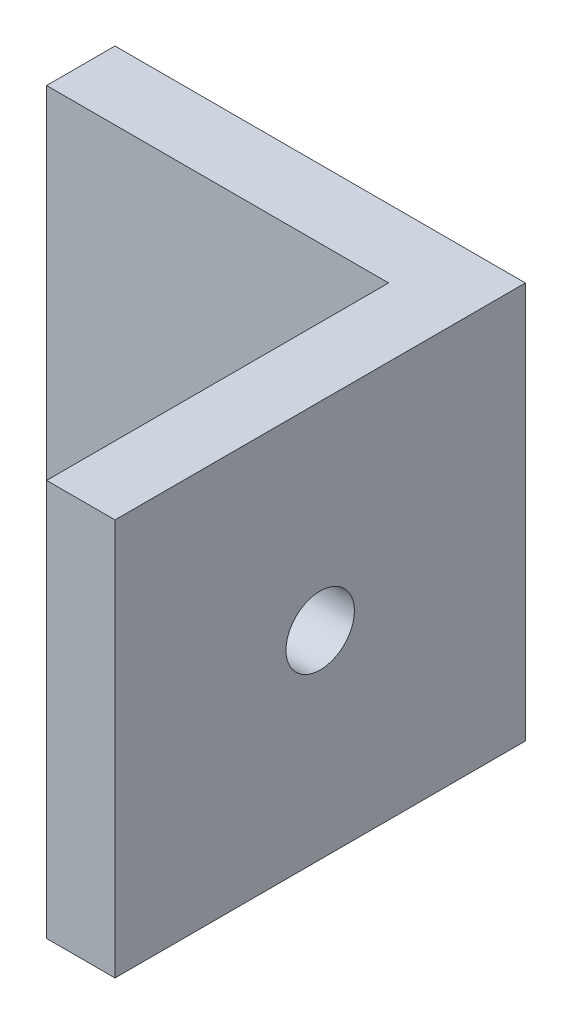
ISO-10303-21;
HEADER;
FILE_DESCRIPTION(('STEP AP214'),'2;1');
FILE_NAME('part.step','',(''),(''),'','','');
FILE_SCHEMA(('AUTOMOTIVE_DESIGN { 1 0 10303 214 1 1 1 1 }'));
ENDSEC;
DATA;
#1=APPLICATION_CONTEXT('core data for automotive mechanical design processes');
#2=APPLICATION_PROTOCOL_DEFINITION('international standard','automotive_design',2000,#1);
#3=PRODUCT_CONTEXT('',#1,'mechanical');
#4=PRODUCT('Part','Part','',(#3));
#5=PRODUCT_RELATED_PRODUCT_CATEGORY('part','',(#4));
#6=PRODUCT_DEFINITION_FORMATION('','',#4);
#7=PRODUCT_DEFINITION_CONTEXT('part definition',#1,'design');
#8=PRODUCT_DEFINITION('design','',#6,#7);
#9=PRODUCT_DEFINITION_SHAPE('','',#8);
#10=(LENGTH_UNIT() NAMED_UNIT(*) SI_UNIT(.MILLI.,.METRE.));
#11=(NAMED_UNIT(*) PLANE_ANGLE_UNIT() SI_UNIT($,.RADIAN.));
#12=(NAMED_UNIT(*) SI_UNIT($,.STERADIAN.) SOLID_ANGLE_UNIT());
#13=UNCERTAINTY_MEASURE_WITH_UNIT(LENGTH_MEASURE(1.E-05),#10,'distance_accuracy_value','');
#14=(GEOMETRIC_REPRESENTATION_CONTEXT(3) GLOBAL_UNCERTAINTY_ASSIGNED_CONTEXT((#13)) GLOBAL_UNIT_ASSIGNED_CONTEXT((#10,
#11,#12)) REPRESENTATION_CONTEXT('',''));
#15=CARTESIAN_POINT('',(0.,0.,0.));
#16=DIRECTION('',(0.,0.,1.));
#17=DIRECTION('',(1.,0.,0.));
#18=AXIS2_PLACEMENT_3D('',#15,#16,#17);
#19=CARTESIAN_POINT('',(0.,36.83,0.));
#20=DIRECTION('',(1.,0.,0.));
#21=DIRECTION('',(0.,0.,-1.));
#22=AXIS2_PLACEMENT_3D('',#19,#20,#21);
#23=PLANE('',#22);
#24=DIRECTION('',(0.,1.,0.));
#25=VECTOR('',#24,1.);
#26=CARTESIAN_POINT('',(0.,0.,-31.75));
#27=LINE('',#26,#25);
#28=CARTESIAN_POINT('',(0.,0.,-31.75));
#29=VERTEX_POINT('',#28);
#30=CARTESIAN_POINT('',(0.,36.83,-31.75));
#31=VERTEX_POINT('',#30);
#32=EDGE_CURVE('E54',#29,#31,#27,.T.);
#33=ORIENTED_EDGE('',*,*,#32,.T.);
#34=DIRECTION('',(0.,0.,1.));
#35=VECTOR('',#34,1.);
#36=CARTESIAN_POINT('',(0.,36.83,0.));
#37=LINE('',#36,#35);
#38=CARTESIAN_POINT('',(0.,36.83,-38.1));
#39=VERTEX_POINT('',#38);
#40=EDGE_CURVE('E140',#39,#31,#37,.T.);
#41=ORIENTED_EDGE('',*,*,#40,.F.);
#42=DIRECTION('',(0.,-1.,0.));
#43=VECTOR('',#42,1.);
#44=CARTESIAN_POINT('',(0.,36.83,-38.1));
#45=LINE('',#44,#43);
#46=CARTESIAN_POINT('',(0.,0.,-38.1));
#47=VERTEX_POINT('',#46);
#48=EDGE_CURVE('E150',#39,#47,#45,.T.);
#49=ORIENTED_EDGE('',*,*,#48,.T.);
#50=DIRECTION('',(0.,0.,1.));
#51=VECTOR('',#50,1.);
#52=CARTESIAN_POINT('',(0.,0.,0.));
#53=LINE('',#52,#51);
#54=EDGE_CURVE('E137',#47,#29,#53,.T.);
#55=ORIENTED_EDGE('',*,*,#54,.T.);
#56=EDGE_LOOP('',(#33,#41,#49,#55));
#57=FACE_BOUND('',#56,.T.);
#58=ADVANCED_FACE('F39',(#57),#23,.F.);
#59=CARTESIAN_POINT('',(0.,36.83,0.));
#60=DIRECTION('',(0.,0.,-1.));
#61=DIRECTION('',(-1.,0.,0.));
#62=AXIS2_PLACEMENT_3D('',#59,#60,#61);
#63=PLANE('',#62);
#64=DIRECTION('',(0.,1.,0.));
#65=VECTOR('',#64,1.);
#66=CARTESIAN_POINT('',(31.75,0.,0.));
#67=LINE('',#66,#65);
#68=CARTESIAN_POINT('',(31.75,0.,0.));
#69=VERTEX_POINT('',#68);
#70=CARTESIAN_POINT('',(31.75,36.83,0.));
#71=VERTEX_POINT('',#70);
#72=EDGE_CURVE('E134',#69,#71,#67,.T.);
#73=ORIENTED_EDGE('',*,*,#72,.F.);
#74=DIRECTION('',(1.,0.,0.));
#75=VECTOR('',#74,1.);
#76=CARTESIAN_POINT('',(0.,0.,0.));
#77=LINE('',#76,#75);
#78=CARTESIAN_POINT('',(38.1,0.,0.));
#79=VERTEX_POINT('',#78);
#80=EDGE_CURVE('E121',#69,#79,#77,.T.);
#81=ORIENTED_EDGE('',*,*,#80,.T.);
#82=DIRECTION('',(0.,-1.,0.));
#83=VECTOR('',#82,1.);
#84=CARTESIAN_POINT('',(38.1,36.83,0.));
#85=LINE('',#84,#83);
#86=CARTESIAN_POINT('',(38.1,36.83,0.));
#87=VERTEX_POINT('',#86);
#88=EDGE_CURVE('E11',#87,#79,#85,.T.);
#89=ORIENTED_EDGE('',*,*,#88,.F.);
#90=DIRECTION('',(1.,0.,0.));
#91=VECTOR('',#90,1.);
#92=CARTESIAN_POINT('',(0.,36.83,0.));
#93=LINE('',#92,#91);
#94=EDGE_CURVE('E85',#71,#87,#93,.T.);
#95=ORIENTED_EDGE('',*,*,#94,.F.);
#96=EDGE_LOOP('',(#73,#81,#89,#95));
#97=FACE_BOUND('',#96,.T.);
#98=ADVANCED_FACE('F170',(#97),#63,.F.);
#99=CARTESIAN_POINT('',(0.,36.83,0.));
#100=DIRECTION('',(0.,-1.,0.));
#101=DIRECTION('',(0.,0.,-1.));
#102=AXIS2_PLACEMENT_3D('',#99,#100,#101);
#103=PLANE('',#102);
#104=DIRECTION('',(0.,0.,1.));
#105=VECTOR('',#104,1.);
#106=CARTESIAN_POINT('',(31.75,36.83,0.));
#107=LINE('',#106,#105);
#108=CARTESIAN_POINT('',(31.75,36.83,-31.75));
#109=VERTEX_POINT('',#108);
#110=EDGE_CURVE('E114',#109,#71,#107,.T.);
#111=ORIENTED_EDGE('',*,*,#110,.T.);
#112=ORIENTED_EDGE('',*,*,#94,.T.);
#113=DIRECTION('',(0.,0.,-1.));
#114=VECTOR('',#113,1.);
#115=CARTESIAN_POINT('',(38.1,36.83,0.));
#116=LINE('',#115,#114);
#117=CARTESIAN_POINT('',(38.1,36.83,-38.1));
#118=VERTEX_POINT('',#117);
#119=EDGE_CURVE('E145',#87,#118,#116,.T.);
#120=ORIENTED_EDGE('',*,*,#119,.T.);
#121=DIRECTION('',(-1.,0.,0.));
#122=VECTOR('',#121,1.);
#123=CARTESIAN_POINT('',(0.,36.83,-38.1));
#124=LINE('',#123,#122);
#125=EDGE_CURVE('E63',#118,#39,#124,.T.);
#126=ORIENTED_EDGE('',*,*,#125,.T.);
#127=ORIENTED_EDGE('',*,*,#40,.T.);
#128=DIRECTION('',(1.,0.,0.));
#129=VECTOR('',#128,1.);
#130=CARTESIAN_POINT('',(0.,36.83,-31.75));
#131=LINE('',#130,#129);
#132=EDGE_CURVE('E123',#31,#109,#131,.T.);
#133=ORIENTED_EDGE('',*,*,#132,.T.);
#134=EDGE_LOOP('',(#111,#112,#120,#126,#127,#133));
#135=FACE_BOUND('',#134,.T.);
#136=ADVANCED_FACE('F168',(#135),#103,.F.);
#137=CARTESIAN_POINT('',(0.,0.,0.));
#138=DIRECTION('',(0.,-1.,0.));
#139=DIRECTION('',(0.,0.,-1.));
#140=AXIS2_PLACEMENT_3D('',#137,#138,#139);
#141=PLANE('',#140);
#142=ORIENTED_EDGE('',*,*,#80,.F.);
#143=DIRECTION('',(0.,0.,1.));
#144=VECTOR('',#143,1.);
#145=CARTESIAN_POINT('',(31.75,0.,0.));
#146=LINE('',#145,#144);
#147=CARTESIAN_POINT('',(31.75,0.,-31.75));
#148=VERTEX_POINT('',#147);
#149=EDGE_CURVE('E109',#148,#69,#146,.T.);
#150=ORIENTED_EDGE('',*,*,#149,.F.);
#151=DIRECTION('',(1.,0.,0.));
#152=VECTOR('',#151,1.);
#153=CARTESIAN_POINT('',(0.,0.,-31.75));
#154=LINE('',#153,#152);
#155=EDGE_CURVE('E99',#29,#148,#154,.T.);
#156=ORIENTED_EDGE('',*,*,#155,.F.);
#157=ORIENTED_EDGE('',*,*,#54,.F.);
#158=DIRECTION('',(-1.,0.,0.));
#159=VECTOR('',#158,1.);
#160=CARTESIAN_POINT('',(0.,0.,-38.1));
#161=LINE('',#160,#159);
#162=CARTESIAN_POINT('',(38.1,0.,-38.1));
#163=VERTEX_POINT('',#162);
#164=EDGE_CURVE('E80',#163,#47,#161,.T.);
#165=ORIENTED_EDGE('',*,*,#164,.F.);
#166=DIRECTION('',(0.,0.,-1.));
#167=VECTOR('',#166,1.);
#168=CARTESIAN_POINT('',(38.1,0.,0.));
#169=LINE('',#168,#167);
#170=EDGE_CURVE('E155',#79,#163,#169,.T.);
#171=ORIENTED_EDGE('',*,*,#170,.F.);
#172=EDGE_LOOP('',(#142,#150,#156,#157,#165,#171));
#173=FACE_BOUND('',#172,.T.);
#174=ADVANCED_FACE('F119',(#173),#141,.T.);
#175=CARTESIAN_POINT('',(38.1,36.83,0.));
#176=DIRECTION('',(-1.,0.,0.));
#177=DIRECTION('',(0.,0.,1.));
#178=AXIS2_PLACEMENT_3D('',#175,#176,#177);
#179=PLANE('',#178);
#180=CARTESIAN_POINT('',(38.1,18.415,-19.05));
#181=DIRECTION('',(-1.,0.,0.));
#182=DIRECTION('',(0.,0.,1.));
#183=AXIS2_PLACEMENT_3D('',#180,#181,#182);
#184=CIRCLE('',#183,3.175);
#185=CARTESIAN_POINT('',(38.1,18.415,-15.875));
#186=VERTEX_POINT('',#185);
#187=EDGE_CURVE('E132',#186,#186,#184,.T.);
#188=ORIENTED_EDGE('',*,*,#187,.T.);
#189=EDGE_LOOP('',(#188));
#190=FACE_BOUND('',#189,.T.);
#191=ORIENTED_EDGE('',*,*,#170,.T.);
#192=DIRECTION('',(0.,-1.,0.));
#193=VECTOR('',#192,1.);
#194=CARTESIAN_POINT('',(38.1,36.83,-38.1));
#195=LINE('',#194,#193);
#196=EDGE_CURVE('E47',#118,#163,#195,.T.);
#197=ORIENTED_EDGE('',*,*,#196,.F.);
#198=ORIENTED_EDGE('',*,*,#119,.F.);
#199=ORIENTED_EDGE('',*,*,#88,.T.);
#200=EDGE_LOOP('',(#191,#197,#198,#199));
#201=FACE_BOUND('',#200,.T.);
#202=ADVANCED_FACE('F171',(#190,#201),#179,.F.);
#203=CARTESIAN_POINT('',(0.,36.83,-38.1));
#204=DIRECTION('',(0.,0.,1.));
#205=DIRECTION('',(1.,0.,0.));
#206=AXIS2_PLACEMENT_3D('',#203,#204,#205);
#207=PLANE('',#206);
#208=CARTESIAN_POINT('',(19.05,18.415,-38.1));
#209=DIRECTION('',(0.,0.,1.));
#210=DIRECTION('',(1.,0.,0.));
#211=AXIS2_PLACEMENT_3D('',#208,#209,#210);
#212=CIRCLE('',#211,3.175);
#213=CARTESIAN_POINT('',(22.225,18.415,-38.1));
#214=VERTEX_POINT('',#213);
#215=EDGE_CURVE('E212',#214,#214,#212,.T.);
#216=ORIENTED_EDGE('',*,*,#215,.T.);
#217=EDGE_LOOP('',(#216));
#218=FACE_BOUND('',#217,.T.);
#219=ORIENTED_EDGE('',*,*,#164,.T.);
#220=ORIENTED_EDGE('',*,*,#48,.F.);
#221=ORIENTED_EDGE('',*,*,#125,.F.);
#222=ORIENTED_EDGE('',*,*,#196,.T.);
#223=EDGE_LOOP('',(#219,#220,#221,#222));
#224=FACE_BOUND('',#223,.T.);
#225=ADVANCED_FACE('F163',(#218,#224),#207,.F.);
#226=CARTESIAN_POINT('',(31.75,0.,0.));
#227=DIRECTION('',(-1.,0.,0.));
#228=DIRECTION('',(0.,0.,1.));
#229=AXIS2_PLACEMENT_3D('',#226,#227,#228);
#230=PLANE('',#229);
#231=CARTESIAN_POINT('',(31.75,18.415,-19.05));
#232=DIRECTION('',(-1.,0.,0.));
#233=DIRECTION('',(0.,0.,1.));
#234=AXIS2_PLACEMENT_3D('',#231,#232,#233);
#235=CIRCLE('',#234,3.175);
#236=CARTESIAN_POINT('',(31.75,18.415,-15.875));
#237=VERTEX_POINT('',#236);
#238=EDGE_CURVE('E128',#237,#237,#235,.T.);
#239=ORIENTED_EDGE('',*,*,#238,.F.);
#240=EDGE_LOOP('',(#239));
#241=FACE_BOUND('',#240,.T.);
#242=ORIENTED_EDGE('',*,*,#110,.F.);
#243=DIRECTION('',(0.,1.,0.));
#244=VECTOR('',#243,1.);
#245=CARTESIAN_POINT('',(31.75,0.,-31.75));
#246=LINE('',#245,#244);
#247=EDGE_CURVE('E102',#148,#109,#246,.T.);
#248=ORIENTED_EDGE('',*,*,#247,.F.);
#249=ORIENTED_EDGE('',*,*,#149,.T.);
#250=ORIENTED_EDGE('',*,*,#72,.T.);
#251=EDGE_LOOP('',(#242,#248,#249,#250));
#252=FACE_BOUND('',#251,.T.);
#253=ADVANCED_FACE('F112',(#241,#252),#230,.T.);
#254=CARTESIAN_POINT('',(0.,0.,-31.75));
#255=DIRECTION('',(0.,0.,1.));
#256=DIRECTION('',(1.,0.,0.));
#257=AXIS2_PLACEMENT_3D('',#254,#255,#256);
#258=PLANE('',#257);
#259=CARTESIAN_POINT('',(19.05,18.415,-31.75));
#260=DIRECTION('',(0.,0.,1.));
#261=DIRECTION('',(1.,0.,0.));
#262=AXIS2_PLACEMENT_3D('',#259,#260,#261);
#263=CIRCLE('',#262,3.175);
#264=CARTESIAN_POINT('',(22.225,18.415,-31.75));
#265=VERTEX_POINT('',#264);
#266=EDGE_CURVE('E215',#265,#265,#263,.T.);
#267=ORIENTED_EDGE('',*,*,#266,.F.);
#268=EDGE_LOOP('',(#267));
#269=FACE_BOUND('',#268,.T.);
#270=ORIENTED_EDGE('',*,*,#132,.F.);
#271=ORIENTED_EDGE('',*,*,#32,.F.);
#272=ORIENTED_EDGE('',*,*,#155,.T.);
#273=ORIENTED_EDGE('',*,*,#247,.T.);
#274=EDGE_LOOP('',(#270,#271,#272,#273));
#275=FACE_BOUND('',#274,.T.);
#276=ADVANCED_FACE('F101',(#269,#275),#258,.T.);
#277=CARTESIAN_POINT('',(38.1,18.415,-19.05));
#278=DIRECTION('',(-1.,0.,0.));
#279=DIRECTION('',(0.,0.,1.));
#280=AXIS2_PLACEMENT_3D('',#277,#278,#279);
#281=CYLINDRICAL_SURFACE('',#280,3.175);
#282=ORIENTED_EDGE('',*,*,#187,.F.);
#283=EDGE_LOOP('',(#282));
#284=FACE_BOUND('',#283,.T.);
#285=ORIENTED_EDGE('',*,*,#238,.T.);
#286=EDGE_LOOP('',(#285));
#287=FACE_BOUND('',#286,.T.);
#288=ADVANCED_FACE('F199',(#284,#287),#281,.F.);
#289=CARTESIAN_POINT('',(19.05,18.415,-38.1));
#290=DIRECTION('',(0.,0.,1.));
#291=DIRECTION('',(1.,0.,0.));
#292=AXIS2_PLACEMENT_3D('',#289,#290,#291);
#293=CYLINDRICAL_SURFACE('',#292,3.175);
#294=ORIENTED_EDGE('',*,*,#215,.F.);
#295=EDGE_LOOP('',(#294));
#296=FACE_BOUND('',#295,.T.);
#297=ORIENTED_EDGE('',*,*,#266,.T.);
#298=EDGE_LOOP('',(#297));
#299=FACE_BOUND('',#298,.T.);
#300=ADVANCED_FACE('F203',(#296,#299),#293,.F.);
#301=CLOSED_SHELL('',(#58,#98,#136,#174,#202,#225,#253,#276,#288,#300));
#302=MANIFOLD_SOLID_BREP('B2',#301);
#303=ADVANCED_BREP_SHAPE_REPRESENTATION('',(#18,#302),#14);
#304=SHAPE_DEFINITION_REPRESENTATION(#9,#303);
ENDSEC;
END-ISO-10303-21;
